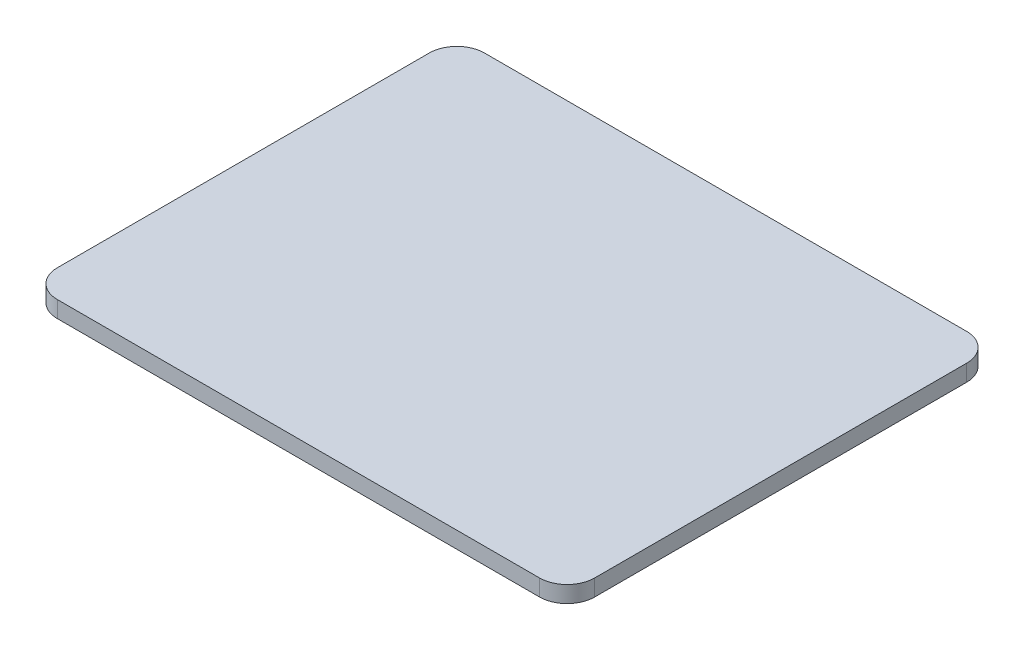
ISO-10303-21;
HEADER;
FILE_DESCRIPTION(('STEP AP214'),'2;1');
FILE_NAME('part.step','',(''),(''),'','','');
FILE_SCHEMA(('AUTOMOTIVE_DESIGN { 1 0 10303 214 1 1 1 1 }'));
ENDSEC;
DATA;
#1=APPLICATION_CONTEXT('core data for automotive mechanical design processes');
#2=APPLICATION_PROTOCOL_DEFINITION('international standard','automotive_design',2000,#1);
#3=PRODUCT_CONTEXT('',#1,'mechanical');
#4=PRODUCT('Part','Part','',(#3));
#5=PRODUCT_RELATED_PRODUCT_CATEGORY('part','',(#4));
#6=PRODUCT_DEFINITION_FORMATION('','',#4);
#7=PRODUCT_DEFINITION_CONTEXT('part definition',#1,'design');
#8=PRODUCT_DEFINITION('design','',#6,#7);
#9=PRODUCT_DEFINITION_SHAPE('','',#8);
#10=(LENGTH_UNIT() NAMED_UNIT(*) SI_UNIT(.MILLI.,.METRE.));
#11=(NAMED_UNIT(*) PLANE_ANGLE_UNIT() SI_UNIT($,.RADIAN.));
#12=(NAMED_UNIT(*) SI_UNIT($,.STERADIAN.) SOLID_ANGLE_UNIT());
#13=UNCERTAINTY_MEASURE_WITH_UNIT(LENGTH_MEASURE(1.E-05),#10,'distance_accuracy_value','');
#14=(GEOMETRIC_REPRESENTATION_CONTEXT(3) GLOBAL_UNCERTAINTY_ASSIGNED_CONTEXT((#13)) GLOBAL_UNIT_ASSIGNED_CONTEXT((#10,
#11,#12)) REPRESENTATION_CONTEXT('',''));
#15=CARTESIAN_POINT('',(0.,0.,0.));
#16=DIRECTION('',(0.,0.,1.));
#17=DIRECTION('',(1.,0.,0.));
#18=AXIS2_PLACEMENT_3D('',#15,#16,#17);
#19=CARTESIAN_POINT('',(97.5,6.,-77.5));
#20=DIRECTION('',(-1.,0.,0.));
#21=DIRECTION('',(0.,0.,1.));
#22=AXIS2_PLACEMENT_3D('',#19,#20,#21);
#23=PLANE('',#22);
#24=DIRECTION('',(0.,0.,-1.));
#25=VECTOR('',#24,1.);
#26=CARTESIAN_POINT('',(97.5,6.,-77.5));
#27=LINE('',#26,#25);
#28=CARTESIAN_POINT('',(97.5,6.,67.5));
#29=VERTEX_POINT('',#28);
#30=CARTESIAN_POINT('',(97.5,6.,-67.5));
#31=VERTEX_POINT('',#30);
#32=EDGE_CURVE('E128',#29,#31,#27,.T.);
#33=ORIENTED_EDGE('',*,*,#32,.F.);
#34=DIRECTION('',(0.,-1.,0.));
#35=VECTOR('',#34,1.);
#36=CARTESIAN_POINT('',(97.5,6.,67.5));
#37=LINE('',#36,#35);
#38=CARTESIAN_POINT('',(97.5,0.,67.5));
#39=VERTEX_POINT('',#38);
#40=EDGE_CURVE('E113',#29,#39,#37,.T.);
#41=ORIENTED_EDGE('',*,*,#40,.T.);
#42=DIRECTION('',(0.,0.,-1.));
#43=VECTOR('',#42,1.);
#44=CARTESIAN_POINT('',(97.5,0.,-77.5));
#45=LINE('',#44,#43);
#46=CARTESIAN_POINT('',(97.5,0.,-67.5));
#47=VERTEX_POINT('',#46);
#48=EDGE_CURVE('E125',#39,#47,#45,.T.);
#49=ORIENTED_EDGE('',*,*,#48,.T.);
#50=DIRECTION('',(0.,-1.,0.));
#51=VECTOR('',#50,1.);
#52=CARTESIAN_POINT('',(97.5,6.,-67.5));
#53=LINE('',#52,#51);
#54=EDGE_CURVE('E130',#47,#31,#53,.F.);
#55=ORIENTED_EDGE('',*,*,#54,.T.);
#56=EDGE_LOOP('',(#33,#41,#49,#55));
#57=FACE_BOUND('',#56,.T.);
#58=ADVANCED_FACE('F40',(#57),#23,.F.);
#59=CARTESIAN_POINT('',(-97.5,6.,-77.5));
#60=DIRECTION('',(0.,0.,1.));
#61=DIRECTION('',(1.,0.,0.));
#62=AXIS2_PLACEMENT_3D('',#59,#60,#61);
#63=PLANE('',#62);
#64=DIRECTION('',(-1.,0.,0.));
#65=VECTOR('',#64,1.);
#66=CARTESIAN_POINT('',(-97.5,6.,-77.5));
#67=LINE('',#66,#65);
#68=CARTESIAN_POINT('',(87.5,6.,-77.5));
#69=VERTEX_POINT('',#68);
#70=CARTESIAN_POINT('',(-87.5,6.,-77.5));
#71=VERTEX_POINT('',#70);
#72=EDGE_CURVE('E188',#69,#71,#67,.T.);
#73=ORIENTED_EDGE('',*,*,#72,.F.);
#74=DIRECTION('',(0.,-1.,0.));
#75=VECTOR('',#74,1.);
#76=CARTESIAN_POINT('',(87.5,6.,-77.5));
#77=LINE('',#76,#75);
#78=CARTESIAN_POINT('',(87.5,0.,-77.5));
#79=VERTEX_POINT('',#78);
#80=EDGE_CURVE('E170',#69,#79,#77,.T.);
#81=ORIENTED_EDGE('',*,*,#80,.T.);
#82=DIRECTION('',(-1.,0.,0.));
#83=VECTOR('',#82,1.);
#84=CARTESIAN_POINT('',(-97.5,0.,-77.5));
#85=LINE('',#84,#83);
#86=CARTESIAN_POINT('',(-87.5,0.,-77.5));
#87=VERTEX_POINT('',#86);
#88=EDGE_CURVE('E135',#79,#87,#85,.T.);
#89=ORIENTED_EDGE('',*,*,#88,.T.);
#90=DIRECTION('',(0.,-1.,0.));
#91=VECTOR('',#90,1.);
#92=CARTESIAN_POINT('',(-87.5,6.,-77.5));
#93=LINE('',#92,#91);
#94=EDGE_CURVE('E168',#87,#71,#93,.F.);
#95=ORIENTED_EDGE('',*,*,#94,.T.);
#96=EDGE_LOOP('',(#73,#81,#89,#95));
#97=FACE_BOUND('',#96,.T.);
#98=ADVANCED_FACE('F199',(#97),#63,.F.);
#99=CARTESIAN_POINT('',(-97.5,6.,-77.5));
#100=DIRECTION('',(1.,0.,0.));
#101=DIRECTION('',(0.,0.,-1.));
#102=AXIS2_PLACEMENT_3D('',#99,#100,#101);
#103=PLANE('',#102);
#104=DIRECTION('',(0.,0.,1.));
#105=VECTOR('',#104,1.);
#106=CARTESIAN_POINT('',(-97.5,0.,-77.5));
#107=LINE('',#106,#105);
#108=CARTESIAN_POINT('',(-97.5,0.,-67.5));
#109=VERTEX_POINT('',#108);
#110=CARTESIAN_POINT('',(-97.5,0.,67.5));
#111=VERTEX_POINT('',#110);
#112=EDGE_CURVE('E141',#109,#111,#107,.T.);
#113=ORIENTED_EDGE('',*,*,#112,.T.);
#114=DIRECTION('',(0.,-1.,0.));
#115=VECTOR('',#114,1.);
#116=CARTESIAN_POINT('',(-97.5,6.,67.5));
#117=LINE('',#116,#115);
#118=CARTESIAN_POINT('',(-97.5,6.,67.5));
#119=VERTEX_POINT('',#118);
#120=EDGE_CURVE('E11',#111,#119,#117,.F.);
#121=ORIENTED_EDGE('',*,*,#120,.T.);
#122=DIRECTION('',(0.,0.,1.));
#123=VECTOR('',#122,1.);
#124=CARTESIAN_POINT('',(-97.5,6.,-77.5));
#125=LINE('',#124,#123);
#126=CARTESIAN_POINT('',(-97.5,6.,-67.5));
#127=VERTEX_POINT('',#126);
#128=EDGE_CURVE('E177',#127,#119,#125,.T.);
#129=ORIENTED_EDGE('',*,*,#128,.F.);
#130=DIRECTION('',(0.,-1.,0.));
#131=VECTOR('',#130,1.);
#132=CARTESIAN_POINT('',(-97.5,6.,-67.5));
#133=LINE('',#132,#131);
#134=EDGE_CURVE('E48',#127,#109,#133,.T.);
#135=ORIENTED_EDGE('',*,*,#134,.T.);
#136=EDGE_LOOP('',(#113,#121,#129,#135));
#137=FACE_BOUND('',#136,.T.);
#138=ADVANCED_FACE('F176',(#137),#103,.F.);
#139=CARTESIAN_POINT('',(-97.5,6.,77.5));
#140=DIRECTION('',(0.,0.,-1.));
#141=DIRECTION('',(-1.,0.,0.));
#142=AXIS2_PLACEMENT_3D('',#139,#140,#141);
#143=PLANE('',#142);
#144=DIRECTION('',(1.,0.,0.));
#145=VECTOR('',#144,1.);
#146=CARTESIAN_POINT('',(-97.5,0.,77.5));
#147=LINE('',#146,#145);
#148=CARTESIAN_POINT('',(-87.5,0.,77.5));
#149=VERTEX_POINT('',#148);
#150=CARTESIAN_POINT('',(87.5,0.,77.5));
#151=VERTEX_POINT('',#150);
#152=EDGE_CURVE('E148',#149,#151,#147,.T.);
#153=ORIENTED_EDGE('',*,*,#152,.T.);
#154=DIRECTION('',(0.,-1.,0.));
#155=VECTOR('',#154,1.);
#156=CARTESIAN_POINT('',(87.5,6.,77.5));
#157=LINE('',#156,#155);
#158=CARTESIAN_POINT('',(87.5,6.,77.5));
#159=VERTEX_POINT('',#158);
#160=EDGE_CURVE('E114',#151,#159,#157,.F.);
#161=ORIENTED_EDGE('',*,*,#160,.T.);
#162=DIRECTION('',(1.,0.,0.));
#163=VECTOR('',#162,1.);
#164=CARTESIAN_POINT('',(-97.5,6.,77.5));
#165=LINE('',#164,#163);
#166=CARTESIAN_POINT('',(-87.5,6.,77.5));
#167=VERTEX_POINT('',#166);
#168=EDGE_CURVE('E144',#167,#159,#165,.T.);
#169=ORIENTED_EDGE('',*,*,#168,.F.);
#170=DIRECTION('',(0.,-1.,0.));
#171=VECTOR('',#170,1.);
#172=CARTESIAN_POINT('',(-87.5,6.,77.5));
#173=LINE('',#172,#171);
#174=EDGE_CURVE('E119',#167,#149,#173,.T.);
#175=ORIENTED_EDGE('',*,*,#174,.T.);
#176=EDGE_LOOP('',(#153,#161,#169,#175));
#177=FACE_BOUND('',#176,.T.);
#178=ADVANCED_FACE('F185',(#177),#143,.F.);
#179=CARTESIAN_POINT('',(0.,6.,0.));
#180=DIRECTION('',(0.,1.,0.));
#181=DIRECTION('',(0.,0.,1.));
#182=AXIS2_PLACEMENT_3D('',#179,#180,#181);
#183=PLANE('',#182);
#184=ORIENTED_EDGE('',*,*,#168,.T.);
#185=CARTESIAN_POINT('',(87.5,6.,67.5));
#186=DIRECTION('',(0.,1.,0.));
#187=DIRECTION('',(0.,0.,1.));
#188=AXIS2_PLACEMENT_3D('',#185,#186,#187);
#189=CIRCLE('',#188,10.);
#190=EDGE_CURVE('E166',#159,#29,#189,.T.);
#191=ORIENTED_EDGE('',*,*,#190,.T.);
#192=ORIENTED_EDGE('',*,*,#32,.T.);
#193=CARTESIAN_POINT('',(87.5,6.,-67.5));
#194=DIRECTION('',(0.,1.,0.));
#195=DIRECTION('',(0.,0.,1.));
#196=AXIS2_PLACEMENT_3D('',#193,#194,#195);
#197=CIRCLE('',#196,10.);
#198=EDGE_CURVE('E164',#31,#69,#197,.T.);
#199=ORIENTED_EDGE('',*,*,#198,.T.);
#200=ORIENTED_EDGE('',*,*,#72,.T.);
#201=CARTESIAN_POINT('',(-87.5,6.,-67.5));
#202=DIRECTION('',(0.,1.,0.));
#203=DIRECTION('',(0.,0.,1.));
#204=AXIS2_PLACEMENT_3D('',#201,#202,#203);
#205=CIRCLE('',#204,10.);
#206=EDGE_CURVE('E60',#71,#127,#205,.T.);
#207=ORIENTED_EDGE('',*,*,#206,.T.);
#208=ORIENTED_EDGE('',*,*,#128,.T.);
#209=CARTESIAN_POINT('',(-87.5,6.,67.5));
#210=DIRECTION('',(0.,1.,0.));
#211=DIRECTION('',(0.,0.,1.));
#212=AXIS2_PLACEMENT_3D('',#209,#210,#211);
#213=CIRCLE('',#212,10.);
#214=EDGE_CURVE('E162',#119,#167,#213,.T.);
#215=ORIENTED_EDGE('',*,*,#214,.T.);
#216=EDGE_LOOP('',(#184,#191,#192,#199,#200,#207,#208,#215));
#217=FACE_BOUND('',#216,.T.);
#218=ADVANCED_FACE('F193',(#217),#183,.T.);
#219=CARTESIAN_POINT('',(0.,0.,0.));
#220=DIRECTION('',(0.,1.,0.));
#221=DIRECTION('',(0.,0.,1.));
#222=AXIS2_PLACEMENT_3D('',#219,#220,#221);
#223=PLANE('',#222);
#224=ORIENTED_EDGE('',*,*,#48,.F.);
#225=CARTESIAN_POINT('',(87.5,0.,67.5));
#226=DIRECTION('',(0.,1.,0.));
#227=DIRECTION('',(0.,0.,1.));
#228=AXIS2_PLACEMENT_3D('',#225,#226,#227);
#229=CIRCLE('',#228,10.);
#230=EDGE_CURVE('E109',#39,#151,#229,.F.);
#231=ORIENTED_EDGE('',*,*,#230,.T.);
#232=ORIENTED_EDGE('',*,*,#152,.F.);
#233=CARTESIAN_POINT('',(-87.5,0.,67.5));
#234=DIRECTION('',(0.,1.,0.));
#235=DIRECTION('',(0.,0.,1.));
#236=AXIS2_PLACEMENT_3D('',#233,#234,#235);
#237=CIRCLE('',#236,10.);
#238=EDGE_CURVE('E154',#149,#111,#237,.F.);
#239=ORIENTED_EDGE('',*,*,#238,.T.);
#240=ORIENTED_EDGE('',*,*,#112,.F.);
#241=CARTESIAN_POINT('',(-87.5,0.,-67.5));
#242=DIRECTION('',(0.,1.,0.));
#243=DIRECTION('',(0.,0.,1.));
#244=AXIS2_PLACEMENT_3D('',#241,#242,#243);
#245=CIRCLE('',#244,10.);
#246=EDGE_CURVE('E129',#109,#87,#245,.F.);
#247=ORIENTED_EDGE('',*,*,#246,.T.);
#248=ORIENTED_EDGE('',*,*,#88,.F.);
#249=CARTESIAN_POINT('',(87.5,0.,-67.5));
#250=DIRECTION('',(0.,1.,0.));
#251=DIRECTION('',(0.,0.,1.));
#252=AXIS2_PLACEMENT_3D('',#249,#250,#251);
#253=CIRCLE('',#252,10.);
#254=EDGE_CURVE('E120',#79,#47,#253,.F.);
#255=ORIENTED_EDGE('',*,*,#254,.T.);
#256=EDGE_LOOP('',(#224,#231,#232,#239,#240,#247,#248,#255));
#257=FACE_BOUND('',#256,.T.);
#258=ADVANCED_FACE('F132',(#257),#223,.F.);
#259=CARTESIAN_POINT('',(87.5,6.,67.5));
#260=DIRECTION('',(0.,-1.,0.));
#261=DIRECTION('',(0.,0.,-1.));
#262=AXIS2_PLACEMENT_3D('',#259,#260,#261);
#263=CYLINDRICAL_SURFACE('',#262,10.);
#264=ORIENTED_EDGE('',*,*,#190,.F.);
#265=ORIENTED_EDGE('',*,*,#160,.F.);
#266=ORIENTED_EDGE('',*,*,#230,.F.);
#267=ORIENTED_EDGE('',*,*,#40,.F.);
#268=EDGE_LOOP('',(#264,#265,#266,#267));
#269=FACE_BOUND('',#268,.T.);
#270=ADVANCED_FACE('F112',(#269),#263,.T.);
#271=CARTESIAN_POINT('',(87.5,6.,-67.5));
#272=DIRECTION('',(0.,-1.,0.));
#273=DIRECTION('',(0.,0.,-1.));
#274=AXIS2_PLACEMENT_3D('',#271,#272,#273);
#275=CYLINDRICAL_SURFACE('',#274,10.);
#276=ORIENTED_EDGE('',*,*,#198,.F.);
#277=ORIENTED_EDGE('',*,*,#54,.F.);
#278=ORIENTED_EDGE('',*,*,#254,.F.);
#279=ORIENTED_EDGE('',*,*,#80,.F.);
#280=EDGE_LOOP('',(#276,#277,#278,#279));
#281=FACE_BOUND('',#280,.T.);
#282=ADVANCED_FACE('F197',(#281),#275,.T.);
#283=CARTESIAN_POINT('',(-87.5,6.,67.5));
#284=DIRECTION('',(0.,-1.,0.));
#285=DIRECTION('',(0.,0.,-1.));
#286=AXIS2_PLACEMENT_3D('',#283,#284,#285);
#287=CYLINDRICAL_SURFACE('',#286,10.);
#288=ORIENTED_EDGE('',*,*,#214,.F.);
#289=ORIENTED_EDGE('',*,*,#120,.F.);
#290=ORIENTED_EDGE('',*,*,#238,.F.);
#291=ORIENTED_EDGE('',*,*,#174,.F.);
#292=EDGE_LOOP('',(#288,#289,#290,#291));
#293=FACE_BOUND('',#292,.T.);
#294=ADVANCED_FACE('F182',(#293),#287,.T.);
#295=CARTESIAN_POINT('',(-87.5,6.,-67.5));
#296=DIRECTION('',(0.,-1.,0.));
#297=DIRECTION('',(0.,0.,-1.));
#298=AXIS2_PLACEMENT_3D('',#295,#296,#297);
#299=CYLINDRICAL_SURFACE('',#298,10.);
#300=ORIENTED_EDGE('',*,*,#206,.F.);
#301=ORIENTED_EDGE('',*,*,#94,.F.);
#302=ORIENTED_EDGE('',*,*,#246,.F.);
#303=ORIENTED_EDGE('',*,*,#134,.F.);
#304=EDGE_LOOP('',(#300,#301,#302,#303));
#305=FACE_BOUND('',#304,.T.);
#306=ADVANCED_FACE('F42',(#305),#299,.T.);
#307=CLOSED_SHELL('',(#58,#98,#138,#178,#218,#258,#270,#282,#294,#306));
#308=MANIFOLD_SOLID_BREP('B2',#307);
#309=ADVANCED_BREP_SHAPE_REPRESENTATION('',(#18,#308),#14);
#310=SHAPE_DEFINITION_REPRESENTATION(#9,#309);
ENDSEC;
END-ISO-10303-21;
